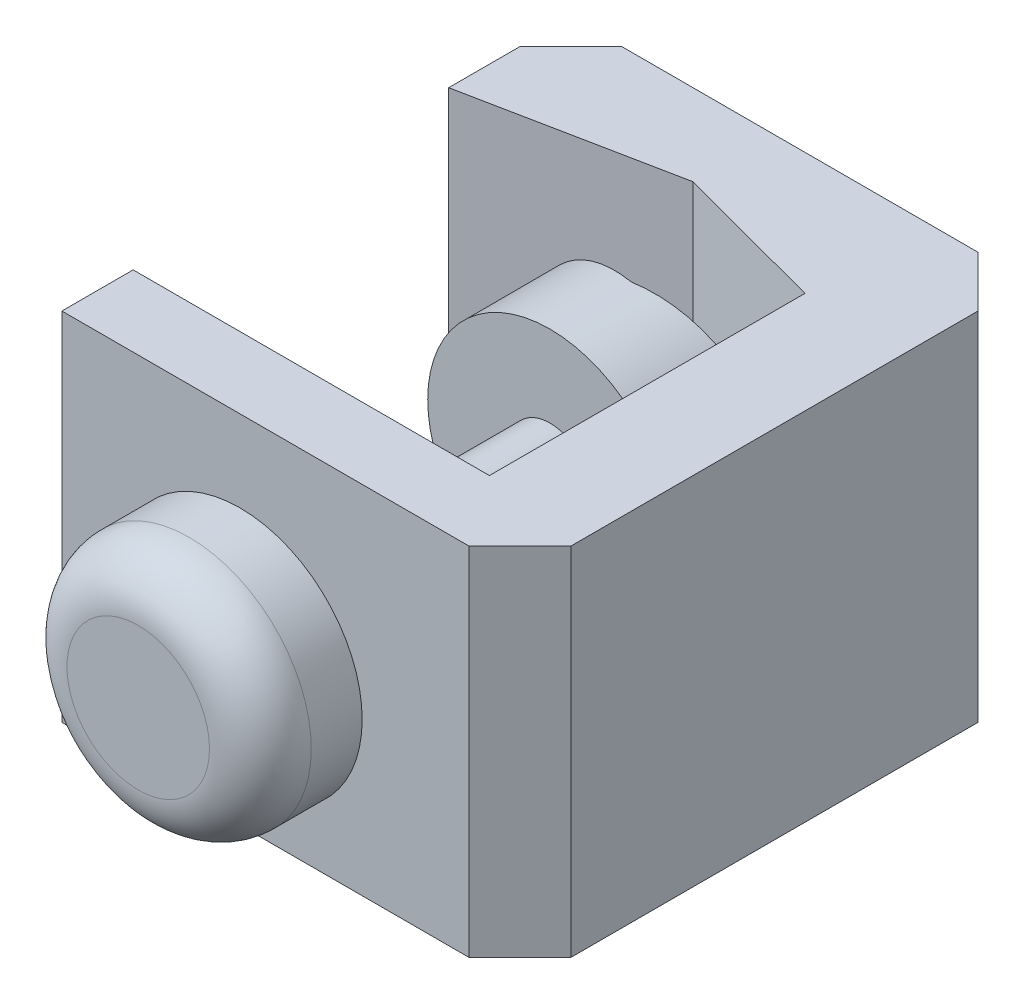
ISO-10303-21;
HEADER;
FILE_DESCRIPTION(('STEP AP214'),'2;1');
FILE_NAME('part.step','',(''),(''),'','','');
FILE_SCHEMA(('AUTOMOTIVE_DESIGN { 1 0 10303 214 1 1 1 1 }'));
ENDSEC;
DATA;
#1=APPLICATION_CONTEXT('core data for automotive mechanical design processes');
#2=APPLICATION_PROTOCOL_DEFINITION('international standard','automotive_design',2000,#1);
#3=PRODUCT_CONTEXT('',#1,'mechanical');
#4=PRODUCT('Part','Part','',(#3));
#5=PRODUCT_RELATED_PRODUCT_CATEGORY('part','',(#4));
#6=PRODUCT_DEFINITION_FORMATION('','',#4);
#7=PRODUCT_DEFINITION_CONTEXT('part definition',#1,'design');
#8=PRODUCT_DEFINITION('design','',#6,#7);
#9=PRODUCT_DEFINITION_SHAPE('','',#8);
#10=(LENGTH_UNIT() NAMED_UNIT(*) SI_UNIT(.MILLI.,.METRE.));
#11=(NAMED_UNIT(*) PLANE_ANGLE_UNIT() SI_UNIT($,.RADIAN.));
#12=(NAMED_UNIT(*) SI_UNIT($,.STERADIAN.) SOLID_ANGLE_UNIT());
#13=UNCERTAINTY_MEASURE_WITH_UNIT(LENGTH_MEASURE(1.E-05),#10,'distance_accuracy_value','');
#14=(GEOMETRIC_REPRESENTATION_CONTEXT(3) GLOBAL_UNCERTAINTY_ASSIGNED_CONTEXT((#13)) GLOBAL_UNIT_ASSIGNED_CONTEXT((#10,
#11,#12)) REPRESENTATION_CONTEXT('',''));
#15=CARTESIAN_POINT('',(0.,0.,0.));
#16=DIRECTION('',(0.,0.,1.));
#17=DIRECTION('',(1.,0.,0.));
#18=AXIS2_PLACEMENT_3D('',#15,#16,#17);
#19=CARTESIAN_POINT('',(0.,0.,12.06));
#20=DIRECTION('',(0.,0.,1.));
#21=DIRECTION('',(1.,0.,0.));
#22=AXIS2_PLACEMENT_3D('',#19,#20,#21);
#23=CYLINDRICAL_SURFACE('',#22,12.);
#24=CARTESIAN_POINT('',(0.,0.,14.06));
#25=DIRECTION('',(-0.164398987305357,0.,0.986393923832144));
#26=DIRECTION('',(0.986393923832144,0.,0.164398987305357));
#27=AXIS2_PLACEMENT_3D('',#24,#25,#26);
#28=ELLIPSE('',#27,12.1655250605964,12.);
#29=CARTESIAN_POINT('',(0.,12.,14.06));
#30=VERTEX_POINT('',#29);
#31=CARTESIAN_POINT('',(0.,-12.,14.06));
#32=VERTEX_POINT('',#31);
#33=EDGE_CURVE('E77',#30,#32,#28,.T.);
#34=ORIENTED_EDGE('',*,*,#33,.T.);
#35=CARTESIAN_POINT('',(0.,0.,14.06));
#36=DIRECTION('',(0.164398987305357,0.,0.986393923832144));
#37=DIRECTION('',(-0.986393923832144,0.,0.164398987305357));
#38=AXIS2_PLACEMENT_3D('',#35,#36,#37);
#39=ELLIPSE('',#38,12.1655250605964,12.);
#40=EDGE_CURVE('E75',#32,#30,#39,.T.);
#41=ORIENTED_EDGE('',*,*,#40,.T.);
#42=EDGE_LOOP('',(#34,#41));
#43=FACE_BOUND('',#42,.T.);
#44=CARTESIAN_POINT('',(0.,0.,22.06));
#45=DIRECTION('',(0.,0.,1.));
#46=DIRECTION('',(1.,0.,0.));
#47=AXIS2_PLACEMENT_3D('',#44,#45,#46);
#48=CIRCLE('',#47,12.);
#49=CARTESIAN_POINT('',(12.,0.,22.06));
#50=VERTEX_POINT('',#49);
#51=EDGE_CURVE('E13',#50,#50,#48,.T.);
#52=ORIENTED_EDGE('',*,*,#51,.F.);
#53=EDGE_LOOP('',(#52));
#54=FACE_BOUND('',#53,.T.);
#55=ADVANCED_FACE('F62',(#43,#54),#23,.T.);
#56=CARTESIAN_POINT('',(0.,0.,22.06));
#57=DIRECTION('',(0.,0.,1.));
#58=DIRECTION('',(1.,0.,0.));
#59=AXIS2_PLACEMENT_3D('',#56,#57,#58);
#60=PLANE('',#59);
#61=ORIENTED_EDGE('',*,*,#51,.T.);
#62=EDGE_LOOP('',(#61));
#63=FACE_BOUND('',#62,.T.);
#64=ADVANCED_FACE('F88',(#63),#60,.T.);
#65=CARTESIAN_POINT('',(-2.28,17.501,13.68));
#66=DIRECTION('',(-0.164398987305357,0.,0.986393923832144));
#67=DIRECTION('',(0.986393923832144,0.,0.164398987305357));
#68=AXIS2_PLACEMENT_3D('',#65,#66,#67);
#69=PLANE('',#68);
#70=DIRECTION('',(0.,-1.,0.));
#71=VECTOR('',#70,1.);
#72=CARTESIAN_POINT('',(0.,17.501,14.06));
#73=LINE('',#72,#71);
#74=EDGE_CURVE('E69',#30,#32,#73,.T.);
#75=ORIENTED_EDGE('',*,*,#74,.T.);
#76=ORIENTED_EDGE('',*,*,#33,.F.);
#77=EDGE_LOOP('',(#75,#76));
#78=FACE_BOUND('',#77,.T.);
#79=ADVANCED_FACE('F86',(#78),#69,.F.);
#80=CARTESIAN_POINT('',(2.28,17.501,13.68));
#81=DIRECTION('',(0.164398987305357,0.,0.986393923832144));
#82=DIRECTION('',(0.986393923832144,0.,-0.164398987305357));
#83=AXIS2_PLACEMENT_3D('',#80,#81,#82);
#84=PLANE('',#83);
#85=ORIENTED_EDGE('',*,*,#74,.F.);
#86=ORIENTED_EDGE('',*,*,#40,.F.);
#87=EDGE_LOOP('',(#85,#86));
#88=FACE_BOUND('',#87,.T.);
#89=ADVANCED_FACE('F84',(#88),#84,.F.);
#90=CLOSED_SHELL('',(#55,#64,#79,#89));
#91=MANIFOLD_SOLID_BREP('B2',#90);
#92=CARTESIAN_POINT('',(-20.,-17.5,50.));
#93=DIRECTION('',(1.,0.,0.));
#94=DIRECTION('',(0.,0.,-1.));
#95=AXIS2_PLACEMENT_3D('',#92,#93,#94);
#96=PLANE('',#95);
#97=DIRECTION('',(0.,0.,-1.));
#98=VECTOR('',#97,1.);
#99=CARTESIAN_POINT('',(-20.,17.5,50.));
#100=LINE('',#99,#98);
#101=CARTESIAN_POINT('',(-20.,17.5,50.));
#102=VERTEX_POINT('',#101);
#103=CARTESIAN_POINT('',(-20.,17.5,43.));
#104=VERTEX_POINT('',#103);
#105=EDGE_CURVE('E288',#102,#104,#100,.T.);
#106=ORIENTED_EDGE('',*,*,#105,.T.);
#107=DIRECTION('',(0.,-1.,0.));
#108=VECTOR('',#107,1.);
#109=CARTESIAN_POINT('',(-20.,66.9974746830583,43.));
#110=LINE('',#109,#108);
#111=CARTESIAN_POINT('',(-20.,-17.5,43.));
#112=VERTEX_POINT('',#111);
#113=EDGE_CURVE('E313',#104,#112,#110,.T.);
#114=ORIENTED_EDGE('',*,*,#113,.T.);
#115=DIRECTION('',(0.,0.,-1.));
#116=VECTOR('',#115,1.);
#117=CARTESIAN_POINT('',(-20.,-17.5,50.));
#118=LINE('',#117,#116);
#119=CARTESIAN_POINT('',(-20.,-17.5,50.));
#120=VERTEX_POINT('',#119);
#121=EDGE_CURVE('E245',#120,#112,#118,.T.);
#122=ORIENTED_EDGE('',*,*,#121,.F.);
#123=DIRECTION('',(0.,-1.,0.));
#124=VECTOR('',#123,1.);
#125=CARTESIAN_POINT('',(-20.,-17.5,50.));
#126=LINE('',#125,#124);
#127=EDGE_CURVE('E295',#102,#120,#126,.T.);
#128=ORIENTED_EDGE('',*,*,#127,.F.);
#129=EDGE_LOOP('',(#106,#114,#122,#128));
#130=FACE_BOUND('',#129,.T.);
#131=ADVANCED_FACE('F126',(#130),#96,.F.);
#132=CARTESIAN_POINT('',(-20.,17.5,12.));
#133=VERTEX_POINT('',#132);
#134=CARTESIAN_POINT('',(-20.,17.5,5.00000000000001));
#135=VERTEX_POINT('',#134);
#136=EDGE_CURVE('E290',#133,#135,#100,.T.);
#137=ORIENTED_EDGE('',*,*,#136,.T.);
#138=DIRECTION('',(0.,-1.,0.));
#139=VECTOR('',#138,1.);
#140=CARTESIAN_POINT('',(-20.,-17.5,5.00000000000001));
#141=LINE('',#140,#139);
#142=CARTESIAN_POINT('',(-20.,-17.5,5.00000000000001));
#143=VERTEX_POINT('',#142);
#144=EDGE_CURVE('E244',#135,#143,#141,.T.);
#145=ORIENTED_EDGE('',*,*,#144,.T.);
#146=CARTESIAN_POINT('',(-20.,-17.5,12.));
#147=VERTEX_POINT('',#146);
#148=EDGE_CURVE('E235',#147,#143,#118,.T.);
#149=ORIENTED_EDGE('',*,*,#148,.F.);
#150=DIRECTION('',(0.,-1.,0.));
#151=VECTOR('',#150,1.);
#152=CARTESIAN_POINT('',(-20.,66.9974746830583,12.));
#153=LINE('',#152,#151);
#154=EDGE_CURVE('E218',#133,#147,#153,.T.);
#155=ORIENTED_EDGE('',*,*,#154,.F.);
#156=EDGE_LOOP('',(#137,#145,#149,#155));
#157=FACE_BOUND('',#156,.T.);
#158=ADVANCED_FACE('F242',(#157),#96,.F.);
#159=CARTESIAN_POINT('',(-20.,-17.5,50.));
#160=DIRECTION('',(0.,1.,0.));
#161=DIRECTION('',(0.,0.,1.));
#162=AXIS2_PLACEMENT_3D('',#159,#160,#161);
#163=PLANE('',#162);
#164=ORIENTED_EDGE('',*,*,#148,.T.);
#165=DIRECTION('',(0.707106781186549,0.,-0.707106781186547));
#166=VECTOR('',#165,1.);
#167=CARTESIAN_POINT('',(-20.,-17.5,5.00000000000001));
#168=LINE('',#167,#166);
#169=CARTESIAN_POINT('',(-15.,-17.5,0.));
#170=VERTEX_POINT('',#169);
#171=EDGE_CURVE('E269',#143,#170,#168,.T.);
#172=ORIENTED_EDGE('',*,*,#171,.T.);
#173=DIRECTION('',(1.,0.,0.));
#174=VECTOR('',#173,1.);
#175=CARTESIAN_POINT('',(-20.,-17.5,0.));
#176=LINE('',#175,#174);
#177=CARTESIAN_POINT('',(20.,-17.5,0.));
#178=VERTEX_POINT('',#177);
#179=EDGE_CURVE('E296',#170,#178,#176,.T.);
#180=ORIENTED_EDGE('',*,*,#179,.T.);
#181=DIRECTION('',(0.707106781186549,0.,0.707106781186547));
#182=VECTOR('',#181,1.);
#183=CARTESIAN_POINT('',(25.,-17.5,5.00000000000001));
#184=LINE('',#183,#182);
#185=CARTESIAN_POINT('',(25.,-17.5,5.00000000000001));
#186=VERTEX_POINT('',#185);
#187=EDGE_CURVE('E267',#178,#186,#184,.T.);
#188=ORIENTED_EDGE('',*,*,#187,.T.);
#189=DIRECTION('',(0.,0.,-1.));
#190=VECTOR('',#189,1.);
#191=CARTESIAN_POINT('',(25.,-17.5,50.));
#192=LINE('',#191,#190);
#193=CARTESIAN_POINT('',(25.,-17.5,45.));
#194=VERTEX_POINT('',#193);
#195=EDGE_CURVE('E246',#194,#186,#192,.T.);
#196=ORIENTED_EDGE('',*,*,#195,.F.);
#197=DIRECTION('',(0.707106781186546,0.,-0.707106781186549));
#198=VECTOR('',#197,1.);
#199=CARTESIAN_POINT('',(20.,-17.5,50.));
#200=LINE('',#199,#198);
#201=CARTESIAN_POINT('',(20.,-17.5,50.));
#202=VERTEX_POINT('',#201);
#203=EDGE_CURVE('E265',#194,#202,#200,.F.);
#204=ORIENTED_EDGE('',*,*,#203,.T.);
#205=DIRECTION('',(1.,0.,0.));
#206=VECTOR('',#205,1.);
#207=CARTESIAN_POINT('',(-20.,-17.5,50.));
#208=LINE('',#207,#206);
#209=EDGE_CURVE('E301',#120,#202,#208,.T.);
#210=ORIENTED_EDGE('',*,*,#209,.F.);
#211=ORIENTED_EDGE('',*,*,#121,.T.);
#212=DIRECTION('',(-1.,0.,0.));
#213=VECTOR('',#212,1.);
#214=CARTESIAN_POINT('',(-20.,-17.5,43.));
#215=LINE('',#214,#213);
#216=CARTESIAN_POINT('',(15.,-17.5,43.));
#217=VERTEX_POINT('',#216);
#218=EDGE_CURVE('E230',#217,#112,#215,.T.);
#219=ORIENTED_EDGE('',*,*,#218,.F.);
#220=DIRECTION('',(0.,0.,1.));
#221=VECTOR('',#220,1.);
#222=CARTESIAN_POINT('',(15.,-17.5,43.));
#223=LINE('',#222,#221);
#224=CARTESIAN_POINT('',(15.,-17.5,12.));
#225=VERTEX_POINT('',#224);
#226=EDGE_CURVE('E318',#225,#217,#223,.T.);
#227=ORIENTED_EDGE('',*,*,#226,.F.);
#228=DIRECTION('',(0.966234939601246,0.,0.257662650560332));
#229=VECTOR('',#228,1.);
#230=CARTESIAN_POINT('',(15.,-17.5,12.));
#231=LINE('',#230,#229);
#232=CARTESIAN_POINT('',(0.,-17.5,8.));
#233=VERTEX_POINT('',#232);
#234=EDGE_CURVE('E238',#233,#225,#231,.T.);
#235=ORIENTED_EDGE('',*,*,#234,.F.);
#236=DIRECTION('',(0.98058067569092,0.,-0.196116135138184));
#237=VECTOR('',#236,1.);
#238=CARTESIAN_POINT('',(0.,-17.5,8.));
#239=LINE('',#238,#237);
#240=EDGE_CURVE('E221',#147,#233,#239,.T.);
#241=ORIENTED_EDGE('',*,*,#240,.F.);
#242=EDGE_LOOP('',(#164,#172,#180,#188,#196,#204,#210,#211,#219,#227,#235,#241));
#243=FACE_BOUND('',#242,.T.);
#244=ADVANCED_FACE('F234',(#243),#163,.F.);
#245=CARTESIAN_POINT('',(25.,-17.5,50.));
#246=DIRECTION('',(-1.,0.,0.));
#247=DIRECTION('',(0.,0.,1.));
#248=AXIS2_PLACEMENT_3D('',#245,#246,#247);
#249=PLANE('',#248);
#250=ORIENTED_EDGE('',*,*,#195,.T.);
#251=DIRECTION('',(0.,1.,0.));
#252=VECTOR('',#251,1.);
#253=CARTESIAN_POINT('',(25.,17.5,5.00000000000001));
#254=LINE('',#253,#252);
#255=CARTESIAN_POINT('',(25.,17.5,5.00000000000001));
#256=VERTEX_POINT('',#255);
#257=EDGE_CURVE('E135',#186,#256,#254,.T.);
#258=ORIENTED_EDGE('',*,*,#257,.T.);
#259=DIRECTION('',(0.,0.,-1.));
#260=VECTOR('',#259,1.);
#261=CARTESIAN_POINT('',(25.,17.5,50.));
#262=LINE('',#261,#260);
#263=CARTESIAN_POINT('',(25.,17.5,45.));
#264=VERTEX_POINT('',#263);
#265=EDGE_CURVE('E251',#264,#256,#262,.T.);
#266=ORIENTED_EDGE('',*,*,#265,.F.);
#267=DIRECTION('',(0.,-1.,0.));
#268=VECTOR('',#267,1.);
#269=CARTESIAN_POINT('',(25.,-17.5,45.));
#270=LINE('',#269,#268);
#271=EDGE_CURVE('E279',#264,#194,#270,.T.);
#272=ORIENTED_EDGE('',*,*,#271,.T.);
#273=EDGE_LOOP('',(#250,#258,#266,#272));
#274=FACE_BOUND('',#273,.T.);
#275=ADVANCED_FACE('F281',(#274),#249,.F.);
#276=CARTESIAN_POINT('',(-20.,17.5,50.));
#277=DIRECTION('',(0.,-1.,0.));
#278=DIRECTION('',(0.,0.,-1.));
#279=AXIS2_PLACEMENT_3D('',#276,#277,#278);
#280=PLANE('',#279);
#281=DIRECTION('',(-1.,0.,0.));
#282=VECTOR('',#281,1.);
#283=CARTESIAN_POINT('',(-20.,17.5,0.));
#284=LINE('',#283,#282);
#285=CARTESIAN_POINT('',(20.,17.5,0.));
#286=VERTEX_POINT('',#285);
#287=CARTESIAN_POINT('',(-15.,17.5,0.));
#288=VERTEX_POINT('',#287);
#289=EDGE_CURVE('E293',#286,#288,#284,.T.);
#290=ORIENTED_EDGE('',*,*,#289,.T.);
#291=DIRECTION('',(-0.707106781186549,0.,0.707106781186547));
#292=VECTOR('',#291,1.);
#293=CARTESIAN_POINT('',(-20.,17.5,5.00000000000001));
#294=LINE('',#293,#292);
#295=EDGE_CURVE('E277',#288,#135,#294,.T.);
#296=ORIENTED_EDGE('',*,*,#295,.T.);
#297=ORIENTED_EDGE('',*,*,#136,.F.);
#298=DIRECTION('',(-0.98058067569092,0.,0.196116135138184));
#299=VECTOR('',#298,1.);
#300=CARTESIAN_POINT('',(0.,17.5,8.));
#301=LINE('',#300,#299);
#302=CARTESIAN_POINT('',(0.,17.5,8.));
#303=VERTEX_POINT('',#302);
#304=EDGE_CURVE('E224',#303,#133,#301,.T.);
#305=ORIENTED_EDGE('',*,*,#304,.F.);
#306=DIRECTION('',(-0.966234939601246,0.,-0.257662650560332));
#307=VECTOR('',#306,1.);
#308=CARTESIAN_POINT('',(15.,17.5,12.));
#309=LINE('',#308,#307);
#310=CARTESIAN_POINT('',(15.,17.5,12.));
#311=VERTEX_POINT('',#310);
#312=EDGE_CURVE('E316',#311,#303,#309,.T.);
#313=ORIENTED_EDGE('',*,*,#312,.F.);
#314=DIRECTION('',(0.,0.,-1.));
#315=VECTOR('',#314,1.);
#316=CARTESIAN_POINT('',(15.,17.5,43.));
#317=LINE('',#316,#315);
#318=CARTESIAN_POINT('',(15.,17.5,43.));
#319=VERTEX_POINT('',#318);
#320=EDGE_CURVE('E323',#319,#311,#317,.T.);
#321=ORIENTED_EDGE('',*,*,#320,.F.);
#322=DIRECTION('',(1.,0.,0.));
#323=VECTOR('',#322,1.);
#324=CARTESIAN_POINT('',(-20.,17.5,43.));
#325=LINE('',#324,#323);
#326=EDGE_CURVE('E306',#104,#319,#325,.T.);
#327=ORIENTED_EDGE('',*,*,#326,.F.);
#328=ORIENTED_EDGE('',*,*,#105,.F.);
#329=DIRECTION('',(-1.,0.,0.));
#330=VECTOR('',#329,1.);
#331=CARTESIAN_POINT('',(-20.,17.5,50.));
#332=LINE('',#331,#330);
#333=CARTESIAN_POINT('',(20.,17.5,50.));
#334=VERTEX_POINT('',#333);
#335=EDGE_CURVE('E299',#334,#102,#332,.T.);
#336=ORIENTED_EDGE('',*,*,#335,.F.);
#337=DIRECTION('',(-0.707106781186546,0.,0.707106781186549));
#338=VECTOR('',#337,1.);
#339=CARTESIAN_POINT('',(20.,17.5,50.));
#340=LINE('',#339,#338);
#341=EDGE_CURVE('E150',#334,#264,#340,.F.);
#342=ORIENTED_EDGE('',*,*,#341,.T.);
#343=ORIENTED_EDGE('',*,*,#265,.T.);
#344=DIRECTION('',(-0.707106781186549,0.,-0.707106781186547));
#345=VECTOR('',#344,1.);
#346=CARTESIAN_POINT('',(25.,17.5,5.00000000000001));
#347=LINE('',#346,#345);
#348=EDGE_CURVE('E142',#256,#286,#347,.T.);
#349=ORIENTED_EDGE('',*,*,#348,.T.);
#350=EDGE_LOOP('',(#290,#296,#297,#305,#313,#321,#327,#328,#336,#342,#343,#349));
#351=FACE_BOUND('',#350,.T.);
#352=ADVANCED_FACE('F286',(#351),#280,.F.);
#353=CARTESIAN_POINT('',(0.,0.,50.));
#354=DIRECTION('',(0.,0.,-1.));
#355=DIRECTION('',(-1.,0.,0.));
#356=AXIS2_PLACEMENT_3D('',#353,#354,#355);
#357=PLANE('',#356);
#358=CARTESIAN_POINT('',(0.,0.,50.));
#359=DIRECTION('',(0.,0.,-1.));
#360=DIRECTION('',(-1.,0.,0.));
#361=AXIS2_PLACEMENT_3D('',#358,#359,#360);
#362=CIRCLE('',#361,4.);
#363=CARTESIAN_POINT('',(-4.,0.,50.));
#364=VERTEX_POINT('',#363);
#365=EDGE_CURVE('E239',#364,#364,#362,.T.);
#366=ORIENTED_EDGE('',*,*,#365,.T.);
#367=EDGE_LOOP('',(#366));
#368=FACE_BOUND('',#367,.T.);
#369=ORIENTED_EDGE('',*,*,#209,.T.);
#370=DIRECTION('',(0.,1.,0.));
#371=VECTOR('',#370,1.);
#372=CARTESIAN_POINT('',(20.,0.,50.));
#373=LINE('',#372,#371);
#374=EDGE_CURVE('E60',#202,#334,#373,.T.);
#375=ORIENTED_EDGE('',*,*,#374,.T.);
#376=ORIENTED_EDGE('',*,*,#335,.T.);
#377=ORIENTED_EDGE('',*,*,#127,.T.);
#378=EDGE_LOOP('',(#369,#375,#376,#377));
#379=FACE_BOUND('',#378,.T.);
#380=ADVANCED_FACE('F356',(#368,#379),#357,.F.);
#381=CARTESIAN_POINT('',(0.,0.,0.));
#382=DIRECTION('',(0.,0.,-1.));
#383=DIRECTION('',(-1.,0.,0.));
#384=AXIS2_PLACEMENT_3D('',#381,#382,#383);
#385=PLANE('',#384);
#386=CARTESIAN_POINT('',(2.49999999999999,0.,0.));
#387=DIRECTION('',(0.,0.,-1.));
#388=DIRECTION('',(-1.,0.,0.));
#389=AXIS2_PLACEMENT_3D('',#386,#387,#388);
#390=CIRCLE('',#389,5.);
#391=CARTESIAN_POINT('',(-2.50000000000001,0.,0.));
#392=VERTEX_POINT('',#391);
#393=EDGE_CURVE('E338',#392,#392,#390,.T.);
#394=ORIENTED_EDGE('',*,*,#393,.F.);
#395=EDGE_LOOP('',(#394));
#396=FACE_BOUND('',#395,.T.);
#397=ORIENTED_EDGE('',*,*,#179,.F.);
#398=DIRECTION('',(0.,1.,0.));
#399=VECTOR('',#398,1.);
#400=CARTESIAN_POINT('',(-15.,17.5,0.));
#401=LINE('',#400,#399);
#402=EDGE_CURVE('E273',#170,#288,#401,.T.);
#403=ORIENTED_EDGE('',*,*,#402,.T.);
#404=ORIENTED_EDGE('',*,*,#289,.F.);
#405=DIRECTION('',(0.,-1.,0.));
#406=VECTOR('',#405,1.);
#407=CARTESIAN_POINT('',(20.,-17.5,0.));
#408=LINE('',#407,#406);
#409=EDGE_CURVE('E271',#286,#178,#408,.T.);
#410=ORIENTED_EDGE('',*,*,#409,.T.);
#411=EDGE_LOOP('',(#397,#403,#404,#410));
#412=FACE_BOUND('',#411,.T.);
#413=ADVANCED_FACE('F352',(#396,#412),#385,.T.);
#414=CARTESIAN_POINT('',(-20.,66.9974746830583,43.));
#415=DIRECTION('',(0.,0.,1.));
#416=DIRECTION('',(1.,0.,0.));
#417=AXIS2_PLACEMENT_3D('',#414,#415,#416);
#418=PLANE('',#417);
#419=CARTESIAN_POINT('',(0.,0.,43.));
#420=DIRECTION('',(0.,0.,1.));
#421=DIRECTION('',(1.,0.,0.));
#422=AXIS2_PLACEMENT_3D('',#419,#420,#421);
#423=CIRCLE('',#422,4.);
#424=CARTESIAN_POINT('',(4.,0.,43.));
#425=VERTEX_POINT('',#424);
#426=EDGE_CURVE('E255',#425,#425,#423,.T.);
#427=ORIENTED_EDGE('',*,*,#426,.T.);
#428=EDGE_LOOP('',(#427));
#429=FACE_BOUND('',#428,.T.);
#430=ORIENTED_EDGE('',*,*,#326,.T.);
#431=DIRECTION('',(0.,-1.,0.));
#432=VECTOR('',#431,1.);
#433=CARTESIAN_POINT('',(15.,66.9974746830583,43.));
#434=LINE('',#433,#432);
#435=EDGE_CURVE('E311',#319,#217,#434,.T.);
#436=ORIENTED_EDGE('',*,*,#435,.T.);
#437=ORIENTED_EDGE('',*,*,#218,.T.);
#438=ORIENTED_EDGE('',*,*,#113,.F.);
#439=EDGE_LOOP('',(#430,#436,#437,#438));
#440=FACE_BOUND('',#439,.T.);
#441=ADVANCED_FACE('F355',(#429,#440),#418,.F.);
#442=CARTESIAN_POINT('',(15.,66.9974746830583,43.));
#443=DIRECTION('',(1.,0.,0.));
#444=DIRECTION('',(0.,0.,-1.));
#445=AXIS2_PLACEMENT_3D('',#442,#443,#444);
#446=PLANE('',#445);
#447=ORIENTED_EDGE('',*,*,#320,.T.);
#448=DIRECTION('',(0.,-1.,0.));
#449=VECTOR('',#448,1.);
#450=CARTESIAN_POINT('',(15.,66.9974746830583,12.));
#451=LINE('',#450,#449);
#452=EDGE_CURVE('E309',#311,#225,#451,.T.);
#453=ORIENTED_EDGE('',*,*,#452,.T.);
#454=ORIENTED_EDGE('',*,*,#226,.T.);
#455=ORIENTED_EDGE('',*,*,#435,.F.);
#456=EDGE_LOOP('',(#447,#453,#454,#455));
#457=FACE_BOUND('',#456,.T.);
#458=ADVANCED_FACE('F378',(#457),#446,.F.);
#459=CARTESIAN_POINT('',(15.,66.9974746830583,12.));
#460=DIRECTION('',(0.257662650560332,0.,-0.966234939601246));
#461=DIRECTION('',(-0.966234939601246,0.,-0.257662650560332));
#462=AXIS2_PLACEMENT_3D('',#459,#460,#461);
#463=PLANE('',#462);
#464=ORIENTED_EDGE('',*,*,#312,.T.);
#465=DIRECTION('',(0.,-1.,0.));
#466=VECTOR('',#465,1.);
#467=CARTESIAN_POINT('',(0.,66.9974746830583,8.));
#468=LINE('',#467,#466);
#469=EDGE_CURVE('E229',#303,#233,#468,.T.);
#470=ORIENTED_EDGE('',*,*,#469,.T.);
#471=ORIENTED_EDGE('',*,*,#234,.T.);
#472=ORIENTED_EDGE('',*,*,#452,.F.);
#473=EDGE_LOOP('',(#464,#470,#471,#472));
#474=FACE_BOUND('',#473,.T.);
#475=ADVANCED_FACE('F382',(#474),#463,.F.);
#476=CARTESIAN_POINT('',(0.,66.9974746830583,8.));
#477=DIRECTION('',(-0.196116135138184,0.,-0.98058067569092));
#478=DIRECTION('',(-0.98058067569092,0.,0.196116135138184));
#479=AXIS2_PLACEMENT_3D('',#476,#477,#478);
#480=PLANE('',#479);
#481=ORIENTED_EDGE('',*,*,#304,.T.);
#482=ORIENTED_EDGE('',*,*,#154,.T.);
#483=ORIENTED_EDGE('',*,*,#240,.T.);
#484=ORIENTED_EDGE('',*,*,#469,.F.);
#485=EDGE_LOOP('',(#481,#482,#483,#484));
#486=FACE_BOUND('',#485,.T.);
#487=ADVANCED_FACE('F220',(#486),#480,.F.);
#488=CARTESIAN_POINT('',(0.,0.,22.06));
#489=DIRECTION('',(0.,0.,1.));
#490=DIRECTION('',(1.,0.,0.));
#491=AXIS2_PLACEMENT_3D('',#488,#489,#490);
#492=PLANE('',#491);
#493=CARTESIAN_POINT('',(0.,0.,22.06));
#494=DIRECTION('',(0.,0.,1.));
#495=DIRECTION('',(1.,0.,0.));
#496=AXIS2_PLACEMENT_3D('',#493,#494,#495);
#497=CIRCLE('',#496,4.);
#498=CARTESIAN_POINT('',(4.,0.,22.06));
#499=VERTEX_POINT('',#498);
#500=EDGE_CURVE('E258',#499,#499,#497,.T.);
#501=ORIENTED_EDGE('',*,*,#500,.F.);
#502=EDGE_LOOP('',(#501));
#503=FACE_BOUND('',#502,.T.);
#504=ADVANCED_FACE('F389',(#503),#492,.F.);
#505=CARTESIAN_POINT('',(0.,0.,22.06));
#506=DIRECTION('',(0.,0.,1.));
#507=DIRECTION('',(1.,0.,0.));
#508=AXIS2_PLACEMENT_3D('',#505,#506,#507);
#509=CYLINDRICAL_SURFACE('',#508,4.);
#510=ORIENTED_EDGE('',*,*,#500,.T.);
#511=EDGE_LOOP('',(#510));
#512=FACE_BOUND('',#511,.T.);
#513=ORIENTED_EDGE('',*,*,#426,.F.);
#514=EDGE_LOOP('',(#513));
#515=FACE_BOUND('',#514,.T.);
#516=ADVANCED_FACE('F494',(#512,#515),#509,.T.);
#517=CARTESIAN_POINT('',(0.,0.,52.5));
#518=DIRECTION('',(0.,0.,1.));
#519=DIRECTION('',(1.,0.,0.));
#520=AXIS2_PLACEMENT_3D('',#517,#518,#519);
#521=CIRCLE('',#520,4.);
#522=CARTESIAN_POINT('',(4.,0.,52.5));
#523=VERTEX_POINT('',#522);
#524=EDGE_CURVE('E331',#523,#523,#521,.T.);
#525=ORIENTED_EDGE('',*,*,#524,.F.);
#526=EDGE_LOOP('',(#525));
#527=FACE_BOUND('',#526,.T.);
#528=ORIENTED_EDGE('',*,*,#365,.F.);
#529=EDGE_LOOP('',(#528));
#530=FACE_BOUND('',#529,.T.);
#531=ADVANCED_FACE('F485',(#527,#530),#509,.T.);
#532=CARTESIAN_POINT('',(0.,0.,62.5));
#533=DIRECTION('',(0.,0.,-1.));
#534=DIRECTION('',(-1.,0.,0.));
#535=AXIS2_PLACEMENT_3D('',#532,#533,#534);
#536=CYLINDRICAL_SURFACE('',#535,12.);
#537=CARTESIAN_POINT('',(0.,0.,57.5));
#538=DIRECTION('',(0.,0.,1.));
#539=DIRECTION('',(1.,0.,0.));
#540=AXIS2_PLACEMENT_3D('',#537,#538,#539);
#541=CIRCLE('',#540,12.);
#542=CARTESIAN_POINT('',(12.,0.,57.5));
#543=VERTEX_POINT('',#542);
#544=EDGE_CURVE('E261',#543,#543,#541,.F.);
#545=ORIENTED_EDGE('',*,*,#544,.T.);
#546=EDGE_LOOP('',(#545));
#547=FACE_BOUND('',#546,.T.);
#548=CARTESIAN_POINT('',(0.,0.,52.5));
#549=DIRECTION('',(0.,0.,1.));
#550=DIRECTION('',(1.,0.,0.));
#551=AXIS2_PLACEMENT_3D('',#548,#549,#550);
#552=CIRCLE('',#551,12.);
#553=CARTESIAN_POINT('',(12.,0.,52.5));
#554=VERTEX_POINT('',#553);
#555=EDGE_CURVE('E334',#554,#554,#552,.T.);
#556=ORIENTED_EDGE('',*,*,#555,.T.);
#557=EDGE_LOOP('',(#556));
#558=FACE_BOUND('',#557,.T.);
#559=ADVANCED_FACE('F476',(#547,#558),#536,.T.);
#560=CARTESIAN_POINT('',(0.,0.,62.5));
#561=DIRECTION('',(0.,0.,1.));
#562=DIRECTION('',(1.,0.,0.));
#563=AXIS2_PLACEMENT_3D('',#560,#561,#562);
#564=PLANE('',#563);
#565=CARTESIAN_POINT('',(0.,0.,62.5));
#566=DIRECTION('',(0.,0.,1.));
#567=DIRECTION('',(1.,0.,0.));
#568=AXIS2_PLACEMENT_3D('',#565,#566,#567);
#569=CIRCLE('',#568,7.);
#570=CARTESIAN_POINT('',(7.,0.,62.5));
#571=VERTEX_POINT('',#570);
#572=EDGE_CURVE('E249',#571,#571,#569,.T.);
#573=ORIENTED_EDGE('',*,*,#572,.T.);
#574=EDGE_LOOP('',(#573));
#575=FACE_BOUND('',#574,.T.);
#576=ADVANCED_FACE('F466',(#575),#564,.T.);
#577=CARTESIAN_POINT('',(0.,0.,52.5));
#578=DIRECTION('',(0.,0.,1.));
#579=DIRECTION('',(1.,0.,0.));
#580=AXIS2_PLACEMENT_3D('',#577,#578,#579);
#581=PLANE('',#580);
#582=ORIENTED_EDGE('',*,*,#524,.T.);
#583=EDGE_LOOP('',(#582));
#584=FACE_BOUND('',#583,.T.);
#585=ORIENTED_EDGE('',*,*,#555,.F.);
#586=EDGE_LOOP('',(#585));
#587=FACE_BOUND('',#586,.T.);
#588=ADVANCED_FACE('F403',(#584,#587),#581,.F.);
#589=CARTESIAN_POINT('',(0.,0.,57.5));
#590=DIRECTION('',(0.,0.,1.));
#591=DIRECTION('',(1.,0.,0.));
#592=AXIS2_PLACEMENT_3D('',#589,#590,#591);
#593=TOROIDAL_SURFACE('',#592,7.,5.);
#594=ORIENTED_EDGE('',*,*,#544,.F.);
#595=EDGE_LOOP('',(#594));
#596=FACE_BOUND('',#595,.T.);
#597=ORIENTED_EDGE('',*,*,#572,.F.);
#598=EDGE_LOOP('',(#597));
#599=FACE_BOUND('',#598,.T.);
#600=ADVANCED_FACE('F400',(#596,#599),#593,.T.);
#601=CARTESIAN_POINT('',(-20.,-17.5,5.00000000000001));
#602=DIRECTION('',(-0.707106781186547,0.,-0.707106781186549));
#603=DIRECTION('',(0.,1.,0.));
#604=AXIS2_PLACEMENT_3D('',#601,#602,#603);
#605=PLANE('',#604);
#606=ORIENTED_EDGE('',*,*,#295,.F.);
#607=ORIENTED_EDGE('',*,*,#402,.F.);
#608=ORIENTED_EDGE('',*,*,#171,.F.);
#609=ORIENTED_EDGE('',*,*,#144,.F.);
#610=EDGE_LOOP('',(#606,#607,#608,#609));
#611=FACE_BOUND('',#610,.T.);
#612=ADVANCED_FACE('F362',(#611),#605,.T.);
#613=CARTESIAN_POINT('',(25.,-17.5,5.00000000000001));
#614=DIRECTION('',(0.707106781186547,0.,-0.707106781186549));
#615=DIRECTION('',(0.,-1.,0.));
#616=AXIS2_PLACEMENT_3D('',#613,#614,#615);
#617=PLANE('',#616);
#618=ORIENTED_EDGE('',*,*,#187,.F.);
#619=ORIENTED_EDGE('',*,*,#409,.F.);
#620=ORIENTED_EDGE('',*,*,#348,.F.);
#621=ORIENTED_EDGE('',*,*,#257,.F.);
#622=EDGE_LOOP('',(#618,#619,#620,#621));
#623=FACE_BOUND('',#622,.T.);
#624=ADVANCED_FACE('F363',(#623),#617,.T.);
#625=CARTESIAN_POINT('',(20.,0.,50.));
#626=DIRECTION('',(-0.707106781186549,0.,-0.707106781186546));
#627=DIRECTION('',(0.,1.,0.));
#628=AXIS2_PLACEMENT_3D('',#625,#626,#627);
#629=PLANE('',#628);
#630=ORIENTED_EDGE('',*,*,#203,.F.);
#631=ORIENTED_EDGE('',*,*,#271,.F.);
#632=ORIENTED_EDGE('',*,*,#341,.F.);
#633=ORIENTED_EDGE('',*,*,#374,.F.);
#634=EDGE_LOOP('',(#630,#631,#632,#633));
#635=FACE_BOUND('',#634,.T.);
#636=ADVANCED_FACE('F129',(#635),#629,.F.);
#637=CARTESIAN_POINT('',(2.49999999999999,0.,5.));
#638=DIRECTION('',(0.,0.,-1.));
#639=DIRECTION('',(-1.,0.,0.));
#640=AXIS2_PLACEMENT_3D('',#637,#638,#639);
#641=CYLINDRICAL_SURFACE('',#640,5.);
#642=CARTESIAN_POINT('',(2.49999999999999,0.,5.));
#643=DIRECTION('',(0.,0.,-1.));
#644=DIRECTION('',(-1.,0.,0.));
#645=AXIS2_PLACEMENT_3D('',#642,#643,#644);
#646=CIRCLE('',#645,5.);
#647=CARTESIAN_POINT('',(-2.50000000000001,0.,5.));
#648=VERTEX_POINT('',#647);
#649=EDGE_CURVE('E337',#648,#648,#646,.T.);
#650=ORIENTED_EDGE('',*,*,#649,.F.);
#651=EDGE_LOOP('',(#650));
#652=FACE_BOUND('',#651,.T.);
#653=ORIENTED_EDGE('',*,*,#393,.T.);
#654=EDGE_LOOP('',(#653));
#655=FACE_BOUND('',#654,.T.);
#656=ADVANCED_FACE('F346',(#652,#655),#641,.F.);
#657=CARTESIAN_POINT('',(0.,0.,5.));
#658=DIRECTION('',(0.,0.,-1.));
#659=DIRECTION('',(-1.,0.,0.));
#660=AXIS2_PLACEMENT_3D('',#657,#658,#659);
#661=PLANE('',#660);
#662=ORIENTED_EDGE('',*,*,#649,.T.);
#663=EDGE_LOOP('',(#662));
#664=FACE_BOUND('',#663,.T.);
#665=ADVANCED_FACE('F344',(#664),#661,.T.);
#666=CLOSED_SHELL('',(#131,#158,#244,#275,#352,#380,#413,#441,#458,#475,#487,#504,#516,#531,
#559,#576,#588,#600,#612,#624,#636,#656,#665));
#667=MANIFOLD_SOLID_BREP('B7',#666);
#668=ADVANCED_BREP_SHAPE_REPRESENTATION('',(#18,#91,#667),#14);
#669=SHAPE_DEFINITION_REPRESENTATION(#9,#668);
ENDSEC;
END-ISO-10303-21;
